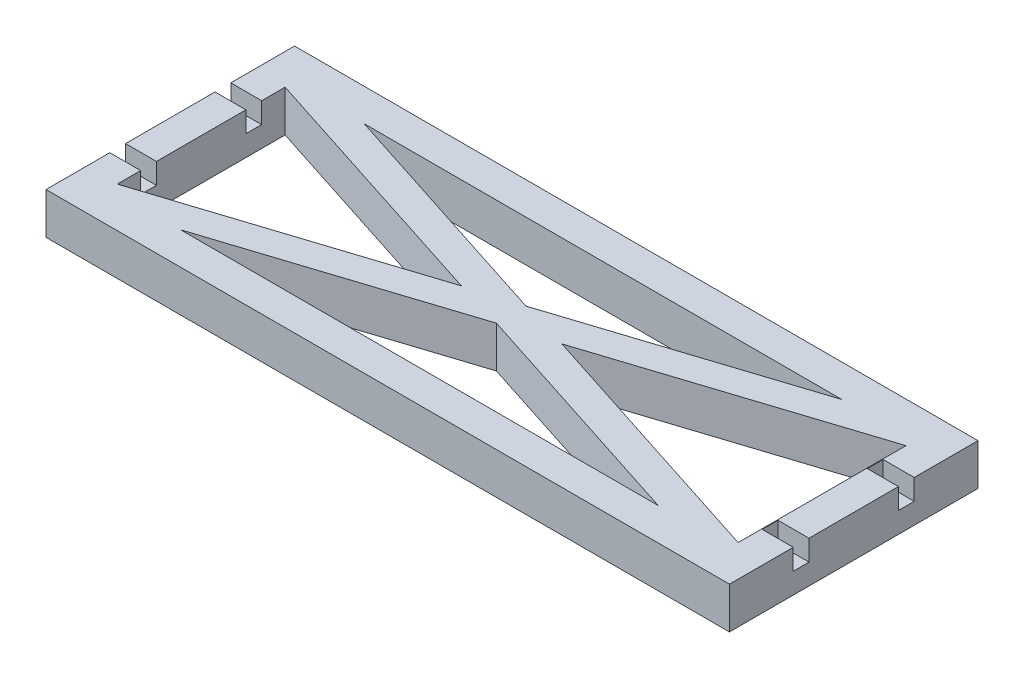
ISO-10303-21;
HEADER;
FILE_DESCRIPTION(('STEP AP214'),'2;1');
FILE_NAME('part.step','',(''),(''),'','','');
FILE_SCHEMA(('AUTOMOTIVE_DESIGN { 1 0 10303 214 1 1 1 1 }'));
ENDSEC;
DATA;
#1=APPLICATION_CONTEXT('core data for automotive mechanical design processes');
#2=APPLICATION_PROTOCOL_DEFINITION('international standard','automotive_design',2000,#1);
#3=PRODUCT_CONTEXT('',#1,'mechanical');
#4=PRODUCT('Part','Part','',(#3));
#5=PRODUCT_RELATED_PRODUCT_CATEGORY('part','',(#4));
#6=PRODUCT_DEFINITION_FORMATION('','',#4);
#7=PRODUCT_DEFINITION_CONTEXT('part definition',#1,'design');
#8=PRODUCT_DEFINITION('design','',#6,#7);
#9=PRODUCT_DEFINITION_SHAPE('','',#8);
#10=(LENGTH_UNIT() NAMED_UNIT(*) SI_UNIT(.MILLI.,.METRE.));
#11=(NAMED_UNIT(*) PLANE_ANGLE_UNIT() SI_UNIT($,.RADIAN.));
#12=(NAMED_UNIT(*) SI_UNIT($,.STERADIAN.) SOLID_ANGLE_UNIT());
#13=UNCERTAINTY_MEASURE_WITH_UNIT(LENGTH_MEASURE(1.E-05),#10,'distance_accuracy_value','');
#14=(GEOMETRIC_REPRESENTATION_CONTEXT(3) GLOBAL_UNCERTAINTY_ASSIGNED_CONTEXT((#13)) GLOBAL_UNIT_ASSIGNED_CONTEXT((#10,
#11,#12)) REPRESENTATION_CONTEXT('',''));
#15=CARTESIAN_POINT('',(0.,0.,0.));
#16=DIRECTION('',(0.,0.,1.));
#17=DIRECTION('',(1.,0.,0.));
#18=AXIS2_PLACEMENT_3D('',#15,#16,#17);
#19=CARTESIAN_POINT('',(82.5,10.,0.));
#20=DIRECTION('',(-1.,0.,0.));
#21=DIRECTION('',(0.,0.,1.));
#22=AXIS2_PLACEMENT_3D('',#19,#20,#21);
#23=PLANE('',#22);
#24=DIRECTION('',(0.,1.,0.));
#25=VECTOR('',#24,1.);
#26=CARTESIAN_POINT('',(82.5,5.,-10.795));
#27=LINE('',#26,#25);
#28=CARTESIAN_POINT('',(82.5,5.,-10.795));
#29=VERTEX_POINT('',#28);
#30=CARTESIAN_POINT('',(82.5,10.,-10.795));
#31=VERTEX_POINT('',#30);
#32=EDGE_CURVE('E262',#29,#31,#27,.T.);
#33=ORIENTED_EDGE('',*,*,#32,.T.);
#34=DIRECTION('',(0.,0.,-1.));
#35=VECTOR('',#34,1.);
#36=CARTESIAN_POINT('',(82.5,10.,0.));
#37=LINE('',#36,#35);
#38=CARTESIAN_POINT('',(82.5,10.,10.795));
#39=VERTEX_POINT('',#38);
#40=EDGE_CURVE('E378',#39,#31,#37,.T.);
#41=ORIENTED_EDGE('',*,*,#40,.F.);
#42=DIRECTION('',(0.,-1.,0.));
#43=VECTOR('',#42,1.);
#44=CARTESIAN_POINT('',(82.5,10.,10.795));
#45=LINE('',#44,#43);
#46=CARTESIAN_POINT('',(82.5,5.,10.795));
#47=VERTEX_POINT('',#46);
#48=EDGE_CURVE('E290',#39,#47,#45,.T.);
#49=ORIENTED_EDGE('',*,*,#48,.T.);
#50=DIRECTION('',(0.,0.,1.));
#51=VECTOR('',#50,1.);
#52=CARTESIAN_POINT('',(82.5,5.,14.605));
#53=LINE('',#52,#51);
#54=CARTESIAN_POINT('',(82.5,5.,14.605));
#55=VERTEX_POINT('',#54);
#56=EDGE_CURVE('E300',#47,#55,#53,.T.);
#57=ORIENTED_EDGE('',*,*,#56,.T.);
#58=DIRECTION('',(0.,1.,0.));
#59=VECTOR('',#58,1.);
#60=CARTESIAN_POINT('',(82.5,10.,14.605));
#61=LINE('',#60,#59);
#62=CARTESIAN_POINT('',(82.5,10.,14.605));
#63=VERTEX_POINT('',#62);
#64=EDGE_CURVE('E297',#55,#63,#61,.T.);
#65=ORIENTED_EDGE('',*,*,#64,.T.);
#66=CARTESIAN_POINT('',(82.5,10.,30.));
#67=VERTEX_POINT('',#66);
#68=EDGE_CURVE('E374',#67,#63,#37,.T.);
#69=ORIENTED_EDGE('',*,*,#68,.F.);
#70=DIRECTION('',(0.,-1.,0.));
#71=VECTOR('',#70,1.);
#72=CARTESIAN_POINT('',(82.5,10.,30.));
#73=LINE('',#72,#71);
#74=CARTESIAN_POINT('',(82.5,0.,30.));
#75=VERTEX_POINT('',#74);
#76=EDGE_CURVE('E448',#67,#75,#73,.T.);
#77=ORIENTED_EDGE('',*,*,#76,.T.);
#78=DIRECTION('',(0.,0.,-1.));
#79=VECTOR('',#78,1.);
#80=CARTESIAN_POINT('',(82.5,0.,0.));
#81=LINE('',#80,#79);
#82=CARTESIAN_POINT('',(82.5,0.,-30.));
#83=VERTEX_POINT('',#82);
#84=EDGE_CURVE('E423',#75,#83,#81,.T.);
#85=ORIENTED_EDGE('',*,*,#84,.T.);
#86=DIRECTION('',(0.,-1.,0.));
#87=VECTOR('',#86,1.);
#88=CARTESIAN_POINT('',(82.5,10.,-30.));
#89=LINE('',#88,#87);
#90=CARTESIAN_POINT('',(82.5,10.,-30.));
#91=VERTEX_POINT('',#90);
#92=EDGE_CURVE('E443',#91,#83,#89,.T.);
#93=ORIENTED_EDGE('',*,*,#92,.F.);
#94=CARTESIAN_POINT('',(82.5,10.,-14.605));
#95=VERTEX_POINT('',#94);
#96=EDGE_CURVE('E373',#95,#91,#37,.T.);
#97=ORIENTED_EDGE('',*,*,#96,.F.);
#98=DIRECTION('',(0.,-1.,0.));
#99=VECTOR('',#98,1.);
#100=CARTESIAN_POINT('',(82.5,10.,-14.605));
#101=LINE('',#100,#99);
#102=CARTESIAN_POINT('',(82.5,5.,-14.605));
#103=VERTEX_POINT('',#102);
#104=EDGE_CURVE('E268',#95,#103,#101,.T.);
#105=ORIENTED_EDGE('',*,*,#104,.T.);
#106=DIRECTION('',(0.,0.,1.));
#107=VECTOR('',#106,1.);
#108=CARTESIAN_POINT('',(82.5,5.,-10.795));
#109=LINE('',#108,#107);
#110=EDGE_CURVE('E271',#103,#29,#109,.T.);
#111=ORIENTED_EDGE('',*,*,#110,.T.);
#112=EDGE_LOOP('',(#33,#41,#49,#57,#65,#69,#77,#85,#93,#97,#105,#111));
#113=FACE_BOUND('',#112,.T.);
#114=ADVANCED_FACE('F40',(#113),#23,.F.);
#115=CARTESIAN_POINT('',(0.,10.,0.));
#116=DIRECTION('',(0.,1.,0.));
#117=DIRECTION('',(0.,0.,1.));
#118=AXIS2_PLACEMENT_3D('',#115,#116,#117);
#119=PLANE('',#118);
#120=DIRECTION('',(1.,0.,0.));
#121=VECTOR('',#120,1.);
#122=CARTESIAN_POINT('',(0.,10.,22.1658349914552));
#123=LINE('',#122,#121);
#124=CARTESIAN_POINT('',(-57.8346231707164,10.,22.1658349914552));
#125=VERTEX_POINT('',#124);
#126=CARTESIAN_POINT('',(57.4604582637845,10.,22.1658349914552));
#127=VERTEX_POINT('',#126);
#128=EDGE_CURVE('E348',#125,#127,#123,.T.);
#129=ORIENTED_EDGE('',*,*,#128,.F.);
#130=DIRECTION('',(0.951708617760551,0.,-0.307002779922759));
#131=VECTOR('',#130,1.);
#132=CARTESIAN_POINT('',(1.02539729526811,10.,3.17873161533114));
#133=LINE('',#132,#131);
#134=CARTESIAN_POINT('',(-0.187082453465993,10.,3.56985411492279));
#135=VERTEX_POINT('',#134);
#136=EDGE_CURVE('E351',#125,#135,#133,.T.);
#137=ORIENTED_EDGE('',*,*,#136,.T.);
#138=DIRECTION('',(0.951708617760551,0.,0.307002779922758));
#139=VECTOR('',#138,1.);
#140=CARTESIAN_POINT('',(-1.06066260223625,10.,3.28805406693238));
#141=LINE('',#140,#139);
#142=EDGE_CURVE('E354',#135,#127,#141,.T.);
#143=ORIENTED_EDGE('',*,*,#142,.T.);
#144=EDGE_LOOP('',(#129,#137,#143));
#145=FACE_BOUND('',#144,.T.);
#146=DIRECTION('',(-0.951708617760551,0.,0.307002779922759));
#147=VECTOR('',#146,1.);
#148=CARTESIAN_POINT('',(1.13471977655831,10.,3.51763130733076));
#149=LINE('',#148,#147);
#150=CARTESIAN_POINT('',(74.8529175465339,10.,-20.2624324894356));
#151=VERTEX_POINT('',#150);
#152=CARTESIAN_POINT('',(12.0393768292836,10.,0.));
#153=VERTEX_POINT('',#152);
#154=EDGE_CURVE('E356',#151,#153,#149,.T.);
#155=ORIENTED_EDGE('',*,*,#154,.F.);
#156=DIRECTION('',(0.,0.,1.));
#157=VECTOR('',#156,1.);
#158=CARTESIAN_POINT('',(74.8529175465339,10.,0.));
#159=LINE('',#158,#157);
#160=CARTESIAN_POINT('',(74.8529175465339,10.,20.2624324894356));
#161=VERTEX_POINT('',#160);
#162=EDGE_CURVE('E359',#151,#161,#159,.T.);
#163=ORIENTED_EDGE('',*,*,#162,.T.);
#164=DIRECTION('',(-0.951708617760551,0.,-0.307002779922759));
#165=VECTOR('',#164,1.);
#166=CARTESIAN_POINT('',(1.13471977655831,10.,-3.51763130733077));
#167=LINE('',#166,#165);
#168=EDGE_CURVE('E362',#161,#153,#167,.T.);
#169=ORIENTED_EDGE('',*,*,#168,.T.);
#170=EDGE_LOOP('',(#155,#163,#169));
#171=FACE_BOUND('',#170,.T.);
#172=DIRECTION('',(0.951708617760551,0.,-0.307002779922758));
#173=VECTOR('',#172,1.);
#174=CARTESIAN_POINT('',(-1.06066260223625,10.,-3.28805406693238));
#175=LINE('',#174,#173);
#176=CARTESIAN_POINT('',(-0.187082453465989,10.,-3.56985411492279));
#177=VERTEX_POINT('',#176);
#178=CARTESIAN_POINT('',(57.4604582637846,10.,-22.1658349914552));
#179=VERTEX_POINT('',#178);
#180=EDGE_CURVE('E364',#177,#179,#175,.T.);
#181=ORIENTED_EDGE('',*,*,#180,.F.);
#182=DIRECTION('',(0.951708617760551,0.,0.307002779922759));
#183=VECTOR('',#182,1.);
#184=CARTESIAN_POINT('',(1.02539729526811,10.,-3.17873161533114));
#185=LINE('',#184,#183);
#186=CARTESIAN_POINT('',(-57.8346231707164,10.,-22.1658349914552));
#187=VERTEX_POINT('',#186);
#188=EDGE_CURVE('E367',#187,#177,#185,.T.);
#189=ORIENTED_EDGE('',*,*,#188,.F.);
#190=DIRECTION('',(-1.,0.,0.));
#191=VECTOR('',#190,1.);
#192=CARTESIAN_POINT('',(0.,10.,-22.1658349914552));
#193=LINE('',#192,#191);
#194=EDGE_CURVE('E370',#179,#187,#193,.T.);
#195=ORIENTED_EDGE('',*,*,#194,.F.);
#196=EDGE_LOOP('',(#181,#189,#195));
#197=FACE_BOUND('',#196,.T.);
#198=ORIENTED_EDGE('',*,*,#40,.T.);
#199=DIRECTION('',(1.,0.,0.));
#200=VECTOR('',#199,1.);
#201=CARTESIAN_POINT('',(75.,10.,-10.795));
#202=LINE('',#201,#200);
#203=CARTESIAN_POINT('',(75.,10.,-10.795));
#204=VERTEX_POINT('',#203);
#205=EDGE_CURVE('E279',#204,#31,#202,.T.);
#206=ORIENTED_EDGE('',*,*,#205,.F.);
#207=DIRECTION('',(0.,0.,-1.));
#208=VECTOR('',#207,1.);
#209=CARTESIAN_POINT('',(75.,10.,-14.605));
#210=LINE('',#209,#208);
#211=CARTESIAN_POINT('',(75.,10.,-14.605));
#212=VERTEX_POINT('',#211);
#213=EDGE_CURVE('E264',#204,#212,#210,.T.);
#214=ORIENTED_EDGE('',*,*,#213,.T.);
#215=DIRECTION('',(1.,0.,0.));
#216=VECTOR('',#215,1.);
#217=CARTESIAN_POINT('',(75.,10.,-14.605));
#218=LINE('',#217,#216);
#219=EDGE_CURVE('E282',#212,#95,#218,.T.);
#220=ORIENTED_EDGE('',*,*,#219,.T.);
#221=ORIENTED_EDGE('',*,*,#96,.T.);
#222=DIRECTION('',(-1.,0.,0.));
#223=VECTOR('',#222,1.);
#224=CARTESIAN_POINT('',(0.,10.,-30.));
#225=LINE('',#224,#223);
#226=CARTESIAN_POINT('',(-82.5,10.,-30.));
#227=VERTEX_POINT('',#226);
#228=EDGE_CURVE('E377',#91,#227,#225,.T.);
#229=ORIENTED_EDGE('',*,*,#228,.T.);
#230=DIRECTION('',(0.,0.,1.));
#231=VECTOR('',#230,1.);
#232=CARTESIAN_POINT('',(-82.5,10.,0.));
#233=LINE('',#232,#231);
#234=CARTESIAN_POINT('',(-82.5,10.,-14.605));
#235=VERTEX_POINT('',#234);
#236=EDGE_CURVE('E381',#227,#235,#233,.T.);
#237=ORIENTED_EDGE('',*,*,#236,.T.);
#238=DIRECTION('',(-1.,0.,0.));
#239=VECTOR('',#238,1.);
#240=CARTESIAN_POINT('',(0.,10.,-14.605));
#241=LINE('',#240,#239);
#242=CARTESIAN_POINT('',(-75.04,10.,-14.605));
#243=VERTEX_POINT('',#242);
#244=EDGE_CURVE('E48',#243,#235,#241,.T.);
#245=ORIENTED_EDGE('',*,*,#244,.F.);
#246=DIRECTION('',(0.,0.,1.));
#247=VECTOR('',#246,1.);
#248=CARTESIAN_POINT('',(-75.04,10.,0.));
#249=LINE('',#248,#247);
#250=CARTESIAN_POINT('',(-75.04,10.,-20.2624324894356));
#251=VERTEX_POINT('',#250);
#252=EDGE_CURVE('E388',#251,#243,#249,.T.);
#253=ORIENTED_EDGE('',*,*,#252,.F.);
#254=DIRECTION('',(0.951708617760551,0.,0.307002779922758));
#255=VECTOR('',#254,1.);
#256=CARTESIAN_POINT('',(-1.15235243004238,10.,3.57229253313137));
#257=LINE('',#256,#255);
#258=CARTESIAN_POINT('',(-12.2264592827496,10.,0.));
#259=VERTEX_POINT('',#258);
#260=EDGE_CURVE('E391',#251,#259,#257,.T.);
#261=ORIENTED_EDGE('',*,*,#260,.T.);
#262=DIRECTION('',(0.951708617760551,0.,-0.307002779922759));
#263=VECTOR('',#262,1.);
#264=CARTESIAN_POINT('',(-1.15235243004238,10.,-3.57229253313138));
#265=LINE('',#264,#263);
#266=CARTESIAN_POINT('',(-75.04,10.,20.2624324894356));
#267=VERTEX_POINT('',#266);
#268=EDGE_CURVE('E394',#267,#259,#265,.T.);
#269=ORIENTED_EDGE('',*,*,#268,.F.);
#270=CARTESIAN_POINT('',(-75.04,10.,14.605));
#271=VERTEX_POINT('',#270);
#272=EDGE_CURVE('E387',#271,#267,#249,.T.);
#273=ORIENTED_EDGE('',*,*,#272,.F.);
#274=DIRECTION('',(1.,0.,0.));
#275=VECTOR('',#274,1.);
#276=CARTESIAN_POINT('',(0.,10.,14.605));
#277=LINE('',#276,#275);
#278=CARTESIAN_POINT('',(-82.5,10.,14.605));
#279=VERTEX_POINT('',#278);
#280=EDGE_CURVE('E479',#279,#271,#277,.T.);
#281=ORIENTED_EDGE('',*,*,#280,.F.);
#282=CARTESIAN_POINT('',(-82.5,10.,30.));
#283=VERTEX_POINT('',#282);
#284=EDGE_CURVE('E380',#279,#283,#233,.T.);
#285=ORIENTED_EDGE('',*,*,#284,.T.);
#286=DIRECTION('',(1.,0.,0.));
#287=VECTOR('',#286,1.);
#288=CARTESIAN_POINT('',(0.,10.,30.));
#289=LINE('',#288,#287);
#290=EDGE_CURVE('E384',#283,#67,#289,.T.);
#291=ORIENTED_EDGE('',*,*,#290,.T.);
#292=ORIENTED_EDGE('',*,*,#68,.T.);
#293=DIRECTION('',(1.,0.,0.));
#294=VECTOR('',#293,1.);
#295=CARTESIAN_POINT('',(75.,10.,14.605));
#296=LINE('',#295,#294);
#297=CARTESIAN_POINT('',(75.,10.,14.605));
#298=VERTEX_POINT('',#297);
#299=EDGE_CURVE('E277',#298,#63,#296,.T.);
#300=ORIENTED_EDGE('',*,*,#299,.F.);
#301=DIRECTION('',(0.,0.,-1.));
#302=VECTOR('',#301,1.);
#303=CARTESIAN_POINT('',(75.,10.,14.605));
#304=LINE('',#303,#302);
#305=CARTESIAN_POINT('',(75.,10.,10.795));
#306=VERTEX_POINT('',#305);
#307=EDGE_CURVE('E293',#298,#306,#304,.T.);
#308=ORIENTED_EDGE('',*,*,#307,.T.);
#309=DIRECTION('',(1.,0.,0.));
#310=VECTOR('',#309,1.);
#311=CARTESIAN_POINT('',(75.,10.,10.795));
#312=LINE('',#311,#310);
#313=EDGE_CURVE('E306',#306,#39,#312,.T.);
#314=ORIENTED_EDGE('',*,*,#313,.T.);
#315=EDGE_LOOP('',(#198,#206,#214,#220,#221,#229,#237,#245,#253,#261,#269,#273,#281,#285,#291,
#292,#300,#308,#314));
#316=FACE_BOUND('',#315,.T.);
#317=ADVANCED_FACE('F495',(#145,#171,#197,#316),#119,.T.);
#318=DIRECTION('',(1.,0.,0.));
#319=VECTOR('',#318,1.);
#320=CARTESIAN_POINT('',(0.,10.,-10.795));
#321=LINE('',#320,#319);
#322=CARTESIAN_POINT('',(-82.5,10.,-10.795));
#323=VERTEX_POINT('',#322);
#324=CARTESIAN_POINT('',(-75.04,10.,-10.795));
#325=VERTEX_POINT('',#324);
#326=EDGE_CURVE('E11',#323,#325,#321,.T.);
#327=ORIENTED_EDGE('',*,*,#326,.F.);
#328=CARTESIAN_POINT('',(-82.5,10.,10.795));
#329=VERTEX_POINT('',#328);
#330=EDGE_CURVE('E385',#323,#329,#233,.T.);
#331=ORIENTED_EDGE('',*,*,#330,.T.);
#332=DIRECTION('',(-1.,0.,0.));
#333=VECTOR('',#332,1.);
#334=CARTESIAN_POINT('',(0.,10.,10.795));
#335=LINE('',#334,#333);
#336=CARTESIAN_POINT('',(-75.04,10.,10.795));
#337=VERTEX_POINT('',#336);
#338=EDGE_CURVE('E447',#337,#329,#335,.T.);
#339=ORIENTED_EDGE('',*,*,#338,.F.);
#340=EDGE_CURVE('E392',#325,#337,#249,.T.);
#341=ORIENTED_EDGE('',*,*,#340,.F.);
#342=EDGE_LOOP('',(#327,#331,#339,#341));
#343=FACE_BOUND('',#342,.T.);
#344=ADVANCED_FACE('F525',(#343),#119,.T.);
#345=CARTESIAN_POINT('',(-75.04,10.,0.));
#346=DIRECTION('',(1.,0.,0.));
#347=DIRECTION('',(0.,0.,-1.));
#348=AXIS2_PLACEMENT_3D('',#345,#346,#347);
#349=PLANE('',#348);
#350=DIRECTION('',(0.,-1.,0.));
#351=VECTOR('',#350,1.);
#352=CARTESIAN_POINT('',(-75.04,10.,-10.795));
#353=LINE('',#352,#351);
#354=CARTESIAN_POINT('',(-75.04,5.,-10.795));
#355=VERTEX_POINT('',#354);
#356=EDGE_CURVE('E341',#325,#355,#353,.T.);
#357=ORIENTED_EDGE('',*,*,#356,.F.);
#358=ORIENTED_EDGE('',*,*,#340,.T.);
#359=DIRECTION('',(0.,1.,0.));
#360=VECTOR('',#359,1.);
#361=CARTESIAN_POINT('',(-75.04,10.,10.795));
#362=LINE('',#361,#360);
#363=CARTESIAN_POINT('',(-75.04,5.,10.795));
#364=VERTEX_POINT('',#363);
#365=EDGE_CURVE('E324',#364,#337,#362,.T.);
#366=ORIENTED_EDGE('',*,*,#365,.F.);
#367=DIRECTION('',(0.,0.,-1.));
#368=VECTOR('',#367,1.);
#369=CARTESIAN_POINT('',(-75.04,5.,0.));
#370=LINE('',#369,#368);
#371=CARTESIAN_POINT('',(-75.04,5.,14.605));
#372=VERTEX_POINT('',#371);
#373=EDGE_CURVE('E343',#372,#364,#370,.T.);
#374=ORIENTED_EDGE('',*,*,#373,.F.);
#375=DIRECTION('',(0.,-1.,0.));
#376=VECTOR('',#375,1.);
#377=CARTESIAN_POINT('',(-75.04,10.,14.605));
#378=LINE('',#377,#376);
#379=EDGE_CURVE('E337',#271,#372,#378,.T.);
#380=ORIENTED_EDGE('',*,*,#379,.F.);
#381=ORIENTED_EDGE('',*,*,#272,.T.);
#382=DIRECTION('',(0.,-1.,0.));
#383=VECTOR('',#382,1.);
#384=CARTESIAN_POINT('',(-75.04,10.,20.2624324894356));
#385=LINE('',#384,#383);
#386=CARTESIAN_POINT('',(-75.04,0.,20.2624324894356));
#387=VERTEX_POINT('',#386);
#388=EDGE_CURVE('E440',#267,#387,#385,.T.);
#389=ORIENTED_EDGE('',*,*,#388,.T.);
#390=DIRECTION('',(0.,0.,1.));
#391=VECTOR('',#390,1.);
#392=CARTESIAN_POINT('',(-75.04,0.,0.));
#393=LINE('',#392,#391);
#394=CARTESIAN_POINT('',(-75.04,0.,-20.2624324894356));
#395=VERTEX_POINT('',#394);
#396=EDGE_CURVE('E432',#395,#387,#393,.T.);
#397=ORIENTED_EDGE('',*,*,#396,.F.);
#398=DIRECTION('',(0.,-1.,0.));
#399=VECTOR('',#398,1.);
#400=CARTESIAN_POINT('',(-75.04,10.,-20.2624324894356));
#401=LINE('',#400,#399);
#402=EDGE_CURVE('E445',#251,#395,#401,.T.);
#403=ORIENTED_EDGE('',*,*,#402,.F.);
#404=ORIENTED_EDGE('',*,*,#252,.T.);
#405=DIRECTION('',(0.,1.,0.));
#406=VECTOR('',#405,1.);
#407=CARTESIAN_POINT('',(-75.04,10.,-14.605));
#408=LINE('',#407,#406);
#409=CARTESIAN_POINT('',(-75.04,5.,-14.605));
#410=VERTEX_POINT('',#409);
#411=EDGE_CURVE('E339',#410,#243,#408,.T.);
#412=ORIENTED_EDGE('',*,*,#411,.F.);
#413=DIRECTION('',(0.,0.,-1.));
#414=VECTOR('',#413,1.);
#415=CARTESIAN_POINT('',(-75.04,5.,0.));
#416=LINE('',#415,#414);
#417=EDGE_CURVE('E345',#355,#410,#416,.T.);
#418=ORIENTED_EDGE('',*,*,#417,.F.);
#419=EDGE_LOOP('',(#357,#358,#366,#374,#380,#381,#389,#397,#403,#404,#412,#418));
#420=FACE_BOUND('',#419,.T.);
#421=ADVANCED_FACE('F537',(#420),#349,.T.);
#422=CARTESIAN_POINT('',(-1.15235243004238,10.,3.57229253313137));
#423=DIRECTION('',(0.307002779922758,0.,-0.951708617760551));
#424=DIRECTION('',(-0.951708617760551,0.,-0.307002779922758));
#425=AXIS2_PLACEMENT_3D('',#422,#423,#424);
#426=PLANE('',#425);
#427=DIRECTION('',(0.951708617760551,0.,0.307002779922758));
#428=VECTOR('',#427,1.);
#429=CARTESIAN_POINT('',(-1.15235243004238,0.,3.57229253313137));
#430=LINE('',#429,#428);
#431=CARTESIAN_POINT('',(-12.2264592827496,0.,0.));
#432=VERTEX_POINT('',#431);
#433=EDGE_CURVE('E435',#395,#432,#430,.T.);
#434=ORIENTED_EDGE('',*,*,#433,.T.);
#435=DIRECTION('',(0.,-1.,0.));
#436=VECTOR('',#435,1.);
#437=CARTESIAN_POINT('',(-12.2264592827496,10.,0.));
#438=LINE('',#437,#436);
#439=EDGE_CURVE('E442',#259,#432,#438,.T.);
#440=ORIENTED_EDGE('',*,*,#439,.F.);
#441=ORIENTED_EDGE('',*,*,#260,.F.);
#442=ORIENTED_EDGE('',*,*,#402,.T.);
#443=EDGE_LOOP('',(#434,#440,#441,#442));
#444=FACE_BOUND('',#443,.T.);
#445=ADVANCED_FACE('F549',(#444),#426,.F.);
#446=CARTESIAN_POINT('',(0.,10.,-30.));
#447=DIRECTION('',(0.,0.,1.));
#448=DIRECTION('',(1.,0.,0.));
#449=AXIS2_PLACEMENT_3D('',#446,#447,#448);
#450=PLANE('',#449);
#451=DIRECTION('',(-1.,0.,0.));
#452=VECTOR('',#451,1.);
#453=CARTESIAN_POINT('',(0.,0.,-30.));
#454=LINE('',#453,#452);
#455=CARTESIAN_POINT('',(-82.5,0.,-30.));
#456=VERTEX_POINT('',#455);
#457=EDGE_CURVE('E426',#83,#456,#454,.T.);
#458=ORIENTED_EDGE('',*,*,#457,.T.);
#459=DIRECTION('',(0.,-1.,0.));
#460=VECTOR('',#459,1.);
#461=CARTESIAN_POINT('',(-82.5,10.,-30.));
#462=LINE('',#461,#460);
#463=EDGE_CURVE('E455',#227,#456,#462,.T.);
#464=ORIENTED_EDGE('',*,*,#463,.F.);
#465=ORIENTED_EDGE('',*,*,#228,.F.);
#466=ORIENTED_EDGE('',*,*,#92,.T.);
#467=EDGE_LOOP('',(#458,#464,#465,#466));
#468=FACE_BOUND('',#467,.T.);
#469=ADVANCED_FACE('F501',(#468),#450,.F.);
#470=CARTESIAN_POINT('',(-82.5,10.,0.));
#471=DIRECTION('',(1.,0.,0.));
#472=DIRECTION('',(0.,0.,-1.));
#473=AXIS2_PLACEMENT_3D('',#470,#471,#472);
#474=PLANE('',#473);
#475=ORIENTED_EDGE('',*,*,#330,.F.);
#476=DIRECTION('',(0.,1.,0.));
#477=VECTOR('',#476,1.);
#478=CARTESIAN_POINT('',(-82.5,5.,-10.795));
#479=LINE('',#478,#477);
#480=CARTESIAN_POINT('',(-82.5,5.,-10.795));
#481=VERTEX_POINT('',#480);
#482=EDGE_CURVE('E312',#481,#323,#479,.T.);
#483=ORIENTED_EDGE('',*,*,#482,.F.);
#484=DIRECTION('',(0.,0.,1.));
#485=VECTOR('',#484,1.);
#486=CARTESIAN_POINT('',(-82.5,5.,-10.795));
#487=LINE('',#486,#485);
#488=CARTESIAN_POINT('',(-82.5,5.,-14.605));
#489=VERTEX_POINT('',#488);
#490=EDGE_CURVE('E318',#489,#481,#487,.T.);
#491=ORIENTED_EDGE('',*,*,#490,.F.);
#492=DIRECTION('',(0.,-1.,0.));
#493=VECTOR('',#492,1.);
#494=CARTESIAN_POINT('',(-82.5,10.,-14.605));
#495=LINE('',#494,#493);
#496=EDGE_CURVE('E314',#235,#489,#495,.T.);
#497=ORIENTED_EDGE('',*,*,#496,.F.);
#498=ORIENTED_EDGE('',*,*,#236,.F.);
#499=ORIENTED_EDGE('',*,*,#463,.T.);
#500=DIRECTION('',(0.,0.,1.));
#501=VECTOR('',#500,1.);
#502=CARTESIAN_POINT('',(-82.5,0.,0.));
#503=LINE('',#502,#501);
#504=CARTESIAN_POINT('',(-82.5,0.,30.));
#505=VERTEX_POINT('',#504);
#506=EDGE_CURVE('E428',#456,#505,#503,.T.);
#507=ORIENTED_EDGE('',*,*,#506,.T.);
#508=DIRECTION('',(0.,-1.,0.));
#509=VECTOR('',#508,1.);
#510=CARTESIAN_POINT('',(-82.5,10.,30.));
#511=LINE('',#510,#509);
#512=EDGE_CURVE('E451',#283,#505,#511,.T.);
#513=ORIENTED_EDGE('',*,*,#512,.F.);
#514=ORIENTED_EDGE('',*,*,#284,.F.);
#515=DIRECTION('',(0.,1.,0.));
#516=VECTOR('',#515,1.);
#517=CARTESIAN_POINT('',(-82.5,10.,14.605));
#518=LINE('',#517,#516);
#519=CARTESIAN_POINT('',(-82.5,5.,14.605));
#520=VERTEX_POINT('',#519);
#521=EDGE_CURVE('E315',#520,#279,#518,.T.);
#522=ORIENTED_EDGE('',*,*,#521,.F.);
#523=DIRECTION('',(0.,0.,1.));
#524=VECTOR('',#523,1.);
#525=CARTESIAN_POINT('',(-82.5,5.,14.605));
#526=LINE('',#525,#524);
#527=CARTESIAN_POINT('',(-82.5,5.,10.795));
#528=VERTEX_POINT('',#527);
#529=EDGE_CURVE('E328',#528,#520,#526,.T.);
#530=ORIENTED_EDGE('',*,*,#529,.F.);
#531=DIRECTION('',(0.,-1.,0.));
#532=VECTOR('',#531,1.);
#533=CARTESIAN_POINT('',(-82.5,10.,10.795));
#534=LINE('',#533,#532);
#535=EDGE_CURVE('E332',#329,#528,#534,.T.);
#536=ORIENTED_EDGE('',*,*,#535,.F.);
#537=EDGE_LOOP('',(#475,#483,#491,#497,#498,#499,#507,#513,#514,#522,#530,#536));
#538=FACE_BOUND('',#537,.T.);
#539=ADVANCED_FACE('F492',(#538),#474,.F.);
#540=CARTESIAN_POINT('',(-1.06066260223625,10.,-3.28805406693238));
#541=DIRECTION('',(-0.307002779922758,0.,-0.951708617760551));
#542=DIRECTION('',(-0.951708617760551,0.,0.307002779922758));
#543=AXIS2_PLACEMENT_3D('',#540,#541,#542);
#544=PLANE('',#543);
#545=DIRECTION('',(0.951708617760551,0.,-0.307002779922758));
#546=VECTOR('',#545,1.);
#547=CARTESIAN_POINT('',(-1.06066260223625,0.,-3.28805406693238));
#548=LINE('',#547,#546);
#549=CARTESIAN_POINT('',(-0.187082453465989,0.,-3.56985411492279));
#550=VERTEX_POINT('',#549);
#551=CARTESIAN_POINT('',(57.4604582637846,0.,-22.1658349914552));
#552=VERTEX_POINT('',#551);
#553=EDGE_CURVE('E414',#550,#552,#548,.T.);
#554=ORIENTED_EDGE('',*,*,#553,.F.);
#555=DIRECTION('',(0.,-1.,0.));
#556=VECTOR('',#555,1.);
#557=CARTESIAN_POINT('',(-0.187082453465989,10.,-3.56985411492279));
#558=LINE('',#557,#556);
#559=EDGE_CURVE('E452',#177,#550,#558,.T.);
#560=ORIENTED_EDGE('',*,*,#559,.F.);
#561=ORIENTED_EDGE('',*,*,#180,.T.);
#562=DIRECTION('',(0.,-1.,0.));
#563=VECTOR('',#562,1.);
#564=CARTESIAN_POINT('',(57.4604582637846,10.,-22.1658349914552));
#565=LINE('',#564,#563);
#566=EDGE_CURVE('E460',#179,#552,#565,.T.);
#567=ORIENTED_EDGE('',*,*,#566,.T.);
#568=EDGE_LOOP('',(#554,#560,#561,#567));
#569=FACE_BOUND('',#568,.T.);
#570=ADVANCED_FACE('F587',(#569),#544,.T.);
#571=CARTESIAN_POINT('',(1.02539729526811,10.,-3.17873161533114));
#572=DIRECTION('',(0.307002779922759,0.,-0.951708617760551));
#573=DIRECTION('',(-0.951708617760551,0.,-0.307002779922759));
#574=AXIS2_PLACEMENT_3D('',#571,#572,#573);
#575=PLANE('',#574);
#576=DIRECTION('',(0.951708617760551,0.,0.307002779922759));
#577=VECTOR('',#576,1.);
#578=CARTESIAN_POINT('',(1.02539729526811,0.,-3.17873161533114));
#579=LINE('',#578,#577);
#580=CARTESIAN_POINT('',(-57.8346231707164,0.,-22.1658349914552));
#581=VERTEX_POINT('',#580);
#582=EDGE_CURVE('E417',#581,#550,#579,.T.);
#583=ORIENTED_EDGE('',*,*,#582,.F.);
#584=DIRECTION('',(0.,-1.,0.));
#585=VECTOR('',#584,1.);
#586=CARTESIAN_POINT('',(-57.8346231707164,10.,-22.1658349914552));
#587=LINE('',#586,#585);
#588=EDGE_CURVE('E462',#187,#581,#587,.T.);
#589=ORIENTED_EDGE('',*,*,#588,.F.);
#590=ORIENTED_EDGE('',*,*,#188,.T.);
#591=ORIENTED_EDGE('',*,*,#559,.T.);
#592=EDGE_LOOP('',(#583,#589,#590,#591));
#593=FACE_BOUND('',#592,.T.);
#594=ADVANCED_FACE('F583',(#593),#575,.T.);
#595=CARTESIAN_POINT('',(1.13471977655831,10.,3.51763130733076));
#596=DIRECTION('',(0.307002779922759,0.,0.951708617760551));
#597=DIRECTION('',(0.951708617760551,0.,-0.307002779922759));
#598=AXIS2_PLACEMENT_3D('',#595,#596,#597);
#599=PLANE('',#598);
#600=DIRECTION('',(-0.951708617760551,0.,0.307002779922759));
#601=VECTOR('',#600,1.);
#602=CARTESIAN_POINT('',(1.13471977655831,0.,3.51763130733076));
#603=LINE('',#602,#601);
#604=CARTESIAN_POINT('',(74.8529175465339,0.,-20.2624324894356));
#605=VERTEX_POINT('',#604);
#606=CARTESIAN_POINT('',(12.0393768292836,0.,0.));
#607=VERTEX_POINT('',#606);
#608=EDGE_CURVE('E405',#605,#607,#603,.T.);
#609=ORIENTED_EDGE('',*,*,#608,.F.);
#610=DIRECTION('',(0.,-1.,0.));
#611=VECTOR('',#610,1.);
#612=CARTESIAN_POINT('',(74.8529175465339,10.,-20.2624324894356));
#613=LINE('',#612,#611);
#614=EDGE_CURVE('E463',#151,#605,#613,.T.);
#615=ORIENTED_EDGE('',*,*,#614,.F.);
#616=ORIENTED_EDGE('',*,*,#154,.T.);
#617=DIRECTION('',(0.,-1.,0.));
#618=VECTOR('',#617,1.);
#619=CARTESIAN_POINT('',(12.0393768292836,10.,0.));
#620=LINE('',#619,#618);
#621=EDGE_CURVE('E466',#153,#607,#620,.T.);
#622=ORIENTED_EDGE('',*,*,#621,.T.);
#623=EDGE_LOOP('',(#609,#615,#616,#622));
#624=FACE_BOUND('',#623,.T.);
#625=ADVANCED_FACE('F586',(#624),#599,.T.);
#626=CARTESIAN_POINT('',(74.8529175465339,10.,0.));
#627=DIRECTION('',(1.,0.,0.));
#628=DIRECTION('',(0.,0.,-1.));
#629=AXIS2_PLACEMENT_3D('',#626,#627,#628);
#630=PLANE('',#629);
#631=DIRECTION('',(0.,0.,1.));
#632=VECTOR('',#631,1.);
#633=CARTESIAN_POINT('',(74.8529175465339,0.,0.));
#634=LINE('',#633,#632);
#635=CARTESIAN_POINT('',(74.8529175465339,0.,20.2624324894356));
#636=VERTEX_POINT('',#635);
#637=EDGE_CURVE('E408',#605,#636,#634,.T.);
#638=ORIENTED_EDGE('',*,*,#637,.T.);
#639=DIRECTION('',(0.,-1.,0.));
#640=VECTOR('',#639,1.);
#641=CARTESIAN_POINT('',(74.8529175465339,10.,20.2624324894356));
#642=LINE('',#641,#640);
#643=EDGE_CURVE('E468',#161,#636,#642,.T.);
#644=ORIENTED_EDGE('',*,*,#643,.F.);
#645=ORIENTED_EDGE('',*,*,#162,.F.);
#646=ORIENTED_EDGE('',*,*,#614,.T.);
#647=EDGE_LOOP('',(#638,#644,#645,#646));
#648=FACE_BOUND('',#647,.T.);
#649=ADVANCED_FACE('F596',(#648),#630,.F.);
#650=CARTESIAN_POINT('',(0.,10.,22.1658349914552));
#651=DIRECTION('',(0.,0.,-1.));
#652=DIRECTION('',(-1.,0.,0.));
#653=AXIS2_PLACEMENT_3D('',#650,#651,#652);
#654=PLANE('',#653);
#655=DIRECTION('',(1.,0.,0.));
#656=VECTOR('',#655,1.);
#657=CARTESIAN_POINT('',(0.,0.,22.1658349914552));
#658=LINE('',#657,#656);
#659=CARTESIAN_POINT('',(-57.8346231707164,0.,22.1658349914552));
#660=VERTEX_POINT('',#659);
#661=CARTESIAN_POINT('',(57.4604582637845,0.,22.1658349914552));
#662=VERTEX_POINT('',#661);
#663=EDGE_CURVE('E347',#660,#662,#658,.T.);
#664=ORIENTED_EDGE('',*,*,#663,.F.);
#665=DIRECTION('',(0.,-1.,0.));
#666=VECTOR('',#665,1.);
#667=CARTESIAN_POINT('',(-57.8346231707164,10.,22.1658349914552));
#668=LINE('',#667,#666);
#669=EDGE_CURVE('E469',#125,#660,#668,.T.);
#670=ORIENTED_EDGE('',*,*,#669,.F.);
#671=ORIENTED_EDGE('',*,*,#128,.T.);
#672=DIRECTION('',(0.,-1.,0.));
#673=VECTOR('',#672,1.);
#674=CARTESIAN_POINT('',(57.4604582637845,10.,22.1658349914552));
#675=LINE('',#674,#673);
#676=EDGE_CURVE('E397',#127,#662,#675,.T.);
#677=ORIENTED_EDGE('',*,*,#676,.T.);
#678=EDGE_LOOP('',(#664,#670,#671,#677));
#679=FACE_BOUND('',#678,.T.);
#680=ADVANCED_FACE('F42',(#679),#654,.T.);
#681=CARTESIAN_POINT('',(1.02539729526811,10.,3.17873161533114));
#682=DIRECTION('',(-0.307002779922759,0.,-0.951708617760551));
#683=DIRECTION('',(-0.951708617760551,0.,0.307002779922759));
#684=AXIS2_PLACEMENT_3D('',#681,#682,#683);
#685=PLANE('',#684);
#686=DIRECTION('',(0.951708617760551,0.,-0.307002779922759));
#687=VECTOR('',#686,1.);
#688=CARTESIAN_POINT('',(1.02539729526811,0.,3.17873161533114));
#689=LINE('',#688,#687);
#690=CARTESIAN_POINT('',(-0.187082453465993,0.,3.56985411492279));
#691=VERTEX_POINT('',#690);
#692=EDGE_CURVE('E400',#660,#691,#689,.T.);
#693=ORIENTED_EDGE('',*,*,#692,.T.);
#694=DIRECTION('',(0.,-1.,0.));
#695=VECTOR('',#694,1.);
#696=CARTESIAN_POINT('',(-0.187082453465993,10.,3.56985411492279));
#697=LINE('',#696,#695);
#698=EDGE_CURVE('E474',#135,#691,#697,.T.);
#699=ORIENTED_EDGE('',*,*,#698,.F.);
#700=ORIENTED_EDGE('',*,*,#136,.F.);
#701=ORIENTED_EDGE('',*,*,#669,.T.);
#702=EDGE_LOOP('',(#693,#699,#700,#701));
#703=FACE_BOUND('',#702,.T.);
#704=ADVANCED_FACE('F605',(#703),#685,.F.);
#705=CARTESIAN_POINT('',(0.,10.,30.));
#706=DIRECTION('',(0.,0.,-1.));
#707=DIRECTION('',(-1.,0.,0.));
#708=AXIS2_PLACEMENT_3D('',#705,#706,#707);
#709=PLANE('',#708);
#710=DIRECTION('',(1.,0.,0.));
#711=VECTOR('',#710,1.);
#712=CARTESIAN_POINT('',(0.,0.,30.));
#713=LINE('',#712,#711);
#714=EDGE_CURVE('E430',#505,#75,#713,.T.);
#715=ORIENTED_EDGE('',*,*,#714,.T.);
#716=ORIENTED_EDGE('',*,*,#76,.F.);
#717=ORIENTED_EDGE('',*,*,#290,.F.);
#718=ORIENTED_EDGE('',*,*,#512,.T.);
#719=EDGE_LOOP('',(#715,#716,#717,#718));
#720=FACE_BOUND('',#719,.T.);
#721=ADVANCED_FACE('F511',(#720),#709,.F.);
#722=CARTESIAN_POINT('',(0.,10.,-22.1658349914552));
#723=DIRECTION('',(0.,0.,1.));
#724=DIRECTION('',(1.,0.,0.));
#725=AXIS2_PLACEMENT_3D('',#722,#723,#724);
#726=PLANE('',#725);
#727=DIRECTION('',(-1.,0.,0.));
#728=VECTOR('',#727,1.);
#729=CARTESIAN_POINT('',(0.,0.,-22.1658349914552));
#730=LINE('',#729,#728);
#731=EDGE_CURVE('E420',#552,#581,#730,.T.);
#732=ORIENTED_EDGE('',*,*,#731,.F.);
#733=ORIENTED_EDGE('',*,*,#566,.F.);
#734=ORIENTED_EDGE('',*,*,#194,.T.);
#735=ORIENTED_EDGE('',*,*,#588,.T.);
#736=EDGE_LOOP('',(#732,#733,#734,#735));
#737=FACE_BOUND('',#736,.T.);
#738=ADVANCED_FACE('F578',(#737),#726,.T.);
#739=CARTESIAN_POINT('',(1.13471977655831,10.,-3.51763130733077));
#740=DIRECTION('',(-0.307002779922759,0.,0.951708617760551));
#741=DIRECTION('',(0.951708617760551,0.,0.307002779922759));
#742=AXIS2_PLACEMENT_3D('',#739,#740,#741);
#743=PLANE('',#742);
#744=DIRECTION('',(-0.951708617760551,0.,-0.307002779922759));
#745=VECTOR('',#744,1.);
#746=CARTESIAN_POINT('',(1.13471977655831,0.,-3.51763130733077));
#747=LINE('',#746,#745);
#748=EDGE_CURVE('E411',#636,#607,#747,.T.);
#749=ORIENTED_EDGE('',*,*,#748,.T.);
#750=ORIENTED_EDGE('',*,*,#621,.F.);
#751=ORIENTED_EDGE('',*,*,#168,.F.);
#752=ORIENTED_EDGE('',*,*,#643,.T.);
#753=EDGE_LOOP('',(#749,#750,#751,#752));
#754=FACE_BOUND('',#753,.T.);
#755=ADVANCED_FACE('F581',(#754),#743,.F.);
#756=CARTESIAN_POINT('',(-1.06066260223625,10.,3.28805406693238));
#757=DIRECTION('',(0.307002779922758,0.,-0.951708617760551));
#758=DIRECTION('',(-0.951708617760551,0.,-0.307002779922758));
#759=AXIS2_PLACEMENT_3D('',#756,#757,#758);
#760=PLANE('',#759);
#761=DIRECTION('',(0.951708617760551,0.,0.307002779922758));
#762=VECTOR('',#761,1.);
#763=CARTESIAN_POINT('',(-1.06066260223625,0.,3.28805406693238));
#764=LINE('',#763,#762);
#765=EDGE_CURVE('E402',#691,#662,#764,.T.);
#766=ORIENTED_EDGE('',*,*,#765,.T.);
#767=ORIENTED_EDGE('',*,*,#676,.F.);
#768=ORIENTED_EDGE('',*,*,#142,.F.);
#769=ORIENTED_EDGE('',*,*,#698,.T.);
#770=EDGE_LOOP('',(#766,#767,#768,#769));
#771=FACE_BOUND('',#770,.T.);
#772=ADVANCED_FACE('F594',(#771),#760,.F.);
#773=CARTESIAN_POINT('',(-1.15235243004238,10.,-3.57229253313138));
#774=DIRECTION('',(-0.307002779922758,0.,-0.951708617760551));
#775=DIRECTION('',(-0.951708617760551,0.,0.307002779922759));
#776=AXIS2_PLACEMENT_3D('',#773,#774,#775);
#777=PLANE('',#776);
#778=DIRECTION('',(0.951708617760551,0.,-0.307002779922759));
#779=VECTOR('',#778,1.);
#780=CARTESIAN_POINT('',(-1.15235243004238,0.,-3.57229253313138));
#781=LINE('',#780,#779);
#782=EDGE_CURVE('E352',#387,#432,#781,.T.);
#783=ORIENTED_EDGE('',*,*,#782,.F.);
#784=ORIENTED_EDGE('',*,*,#388,.F.);
#785=ORIENTED_EDGE('',*,*,#268,.T.);
#786=ORIENTED_EDGE('',*,*,#439,.T.);
#787=EDGE_LOOP('',(#783,#784,#785,#786));
#788=FACE_BOUND('',#787,.T.);
#789=ADVANCED_FACE('F545',(#788),#777,.T.);
#790=CARTESIAN_POINT('',(0.,0.,0.));
#791=DIRECTION('',(0.,1.,0.));
#792=DIRECTION('',(0.,0.,1.));
#793=AXIS2_PLACEMENT_3D('',#790,#791,#792);
#794=PLANE('',#793);
#795=ORIENTED_EDGE('',*,*,#663,.T.);
#796=ORIENTED_EDGE('',*,*,#765,.F.);
#797=ORIENTED_EDGE('',*,*,#692,.F.);
#798=EDGE_LOOP('',(#795,#796,#797));
#799=FACE_BOUND('',#798,.T.);
#800=ORIENTED_EDGE('',*,*,#608,.T.);
#801=ORIENTED_EDGE('',*,*,#748,.F.);
#802=ORIENTED_EDGE('',*,*,#637,.F.);
#803=EDGE_LOOP('',(#800,#801,#802));
#804=FACE_BOUND('',#803,.T.);
#805=ORIENTED_EDGE('',*,*,#553,.T.);
#806=ORIENTED_EDGE('',*,*,#731,.T.);
#807=ORIENTED_EDGE('',*,*,#582,.T.);
#808=EDGE_LOOP('',(#805,#806,#807));
#809=FACE_BOUND('',#808,.T.);
#810=ORIENTED_EDGE('',*,*,#84,.F.);
#811=ORIENTED_EDGE('',*,*,#714,.F.);
#812=ORIENTED_EDGE('',*,*,#506,.F.);
#813=ORIENTED_EDGE('',*,*,#457,.F.);
#814=EDGE_LOOP('',(#810,#811,#812,#813));
#815=FACE_BOUND('',#814,.T.);
#816=ORIENTED_EDGE('',*,*,#396,.T.);
#817=ORIENTED_EDGE('',*,*,#782,.T.);
#818=ORIENTED_EDGE('',*,*,#433,.F.);
#819=EDGE_LOOP('',(#816,#817,#818));
#820=FACE_BOUND('',#819,.T.);
#821=ADVANCED_FACE('F507',(#799,#804,#809,#815,#820),#794,.F.);
#822=CARTESIAN_POINT('',(-75.,10.,14.605));
#823=DIRECTION('',(0.,0.,1.));
#824=DIRECTION('',(0.,-1.,0.));
#825=AXIS2_PLACEMENT_3D('',#822,#823,#824);
#826=PLANE('',#825);
#827=ORIENTED_EDGE('',*,*,#379,.T.);
#828=DIRECTION('',(-1.,0.,0.));
#829=VECTOR('',#828,1.);
#830=CARTESIAN_POINT('',(-75.,5.,14.605));
#831=LINE('',#830,#829);
#832=EDGE_CURVE('E281',#372,#520,#831,.T.);
#833=ORIENTED_EDGE('',*,*,#832,.T.);
#834=ORIENTED_EDGE('',*,*,#521,.T.);
#835=ORIENTED_EDGE('',*,*,#280,.T.);
#836=EDGE_LOOP('',(#827,#833,#834,#835));
#837=FACE_BOUND('',#836,.T.);
#838=ADVANCED_FACE('F635',(#837),#826,.F.);
#839=CARTESIAN_POINT('',(-75.,5.,14.605));
#840=DIRECTION('',(0.,-1.,0.));
#841=DIRECTION('',(0.,0.,-1.));
#842=AXIS2_PLACEMENT_3D('',#839,#840,#841);
#843=PLANE('',#842);
#844=ORIENTED_EDGE('',*,*,#373,.T.);
#845=DIRECTION('',(-1.,0.,0.));
#846=VECTOR('',#845,1.);
#847=CARTESIAN_POINT('',(-75.,5.,10.795));
#848=LINE('',#847,#846);
#849=EDGE_CURVE('E326',#364,#528,#848,.T.);
#850=ORIENTED_EDGE('',*,*,#849,.T.);
#851=ORIENTED_EDGE('',*,*,#529,.T.);
#852=ORIENTED_EDGE('',*,*,#832,.F.);
#853=EDGE_LOOP('',(#844,#850,#851,#852));
#854=FACE_BOUND('',#853,.T.);
#855=ADVANCED_FACE('F563',(#854),#843,.F.);
#856=CARTESIAN_POINT('',(-75.,10.,10.795));
#857=DIRECTION('',(0.,0.,-1.));
#858=DIRECTION('',(0.,1.,0.));
#859=AXIS2_PLACEMENT_3D('',#856,#857,#858);
#860=PLANE('',#859);
#861=ORIENTED_EDGE('',*,*,#365,.T.);
#862=ORIENTED_EDGE('',*,*,#338,.T.);
#863=ORIENTED_EDGE('',*,*,#535,.T.);
#864=ORIENTED_EDGE('',*,*,#849,.F.);
#865=EDGE_LOOP('',(#861,#862,#863,#864));
#866=FACE_BOUND('',#865,.T.);
#867=ADVANCED_FACE('F532',(#866),#860,.F.);
#868=CARTESIAN_POINT('',(-75.,5.,-10.795));
#869=DIRECTION('',(0.,0.,1.));
#870=DIRECTION('',(0.,-1.,0.));
#871=AXIS2_PLACEMENT_3D('',#868,#869,#870);
#872=PLANE('',#871);
#873=ORIENTED_EDGE('',*,*,#356,.T.);
#874=DIRECTION('',(-1.,0.,0.));
#875=VECTOR('',#874,1.);
#876=CARTESIAN_POINT('',(-75.,5.,-10.795));
#877=LINE('',#876,#875);
#878=EDGE_CURVE('E322',#355,#481,#877,.T.);
#879=ORIENTED_EDGE('',*,*,#878,.T.);
#880=ORIENTED_EDGE('',*,*,#482,.T.);
#881=ORIENTED_EDGE('',*,*,#326,.T.);
#882=EDGE_LOOP('',(#873,#879,#880,#881));
#883=FACE_BOUND('',#882,.T.);
#884=ADVANCED_FACE('F555',(#883),#872,.F.);
#885=CARTESIAN_POINT('',(-75.,5.,-10.795));
#886=DIRECTION('',(0.,-1.,0.));
#887=DIRECTION('',(0.,0.,-1.));
#888=AXIS2_PLACEMENT_3D('',#885,#886,#887);
#889=PLANE('',#888);
#890=ORIENTED_EDGE('',*,*,#417,.T.);
#891=DIRECTION('',(-1.,0.,0.));
#892=VECTOR('',#891,1.);
#893=CARTESIAN_POINT('',(-75.,5.,-14.605));
#894=LINE('',#893,#892);
#895=EDGE_CURVE('E321',#410,#489,#894,.T.);
#896=ORIENTED_EDGE('',*,*,#895,.T.);
#897=ORIENTED_EDGE('',*,*,#490,.T.);
#898=ORIENTED_EDGE('',*,*,#878,.F.);
#899=EDGE_LOOP('',(#890,#896,#897,#898));
#900=FACE_BOUND('',#899,.T.);
#901=ADVANCED_FACE('F553',(#900),#889,.F.);
#902=CARTESIAN_POINT('',(-75.,10.,-14.605));
#903=DIRECTION('',(0.,0.,-1.));
#904=DIRECTION('',(-1.,0.,0.));
#905=AXIS2_PLACEMENT_3D('',#902,#903,#904);
#906=PLANE('',#905);
#907=ORIENTED_EDGE('',*,*,#411,.T.);
#908=ORIENTED_EDGE('',*,*,#244,.T.);
#909=ORIENTED_EDGE('',*,*,#496,.T.);
#910=ORIENTED_EDGE('',*,*,#895,.F.);
#911=EDGE_LOOP('',(#907,#908,#909,#910));
#912=FACE_BOUND('',#911,.T.);
#913=ADVANCED_FACE('F483',(#912),#906,.F.);
#914=CARTESIAN_POINT('',(75.,10.,14.605));
#915=DIRECTION('',(0.,0.,-1.));
#916=DIRECTION('',(0.,1.,0.));
#917=AXIS2_PLACEMENT_3D('',#914,#915,#916);
#918=PLANE('',#917);
#919=ORIENTED_EDGE('',*,*,#64,.F.);
#920=DIRECTION('',(1.,0.,0.));
#921=VECTOR('',#920,1.);
#922=CARTESIAN_POINT('',(75.,5.,14.605));
#923=LINE('',#922,#921);
#924=CARTESIAN_POINT('',(75.,5.,14.605));
#925=VERTEX_POINT('',#924);
#926=EDGE_CURVE('E296',#925,#55,#923,.T.);
#927=ORIENTED_EDGE('',*,*,#926,.F.);
#928=DIRECTION('',(0.,1.,0.));
#929=VECTOR('',#928,1.);
#930=CARTESIAN_POINT('',(75.,10.,14.605));
#931=LINE('',#930,#929);
#932=EDGE_CURVE('E286',#925,#298,#931,.T.);
#933=ORIENTED_EDGE('',*,*,#932,.T.);
#934=ORIENTED_EDGE('',*,*,#299,.T.);
#935=EDGE_LOOP('',(#919,#927,#933,#934));
#936=FACE_BOUND('',#935,.T.);
#937=ADVANCED_FACE('F764',(#936),#918,.T.);
#938=CARTESIAN_POINT('',(75.,10.,10.795));
#939=DIRECTION('',(0.,0.,1.));
#940=DIRECTION('',(0.,-1.,0.));
#941=AXIS2_PLACEMENT_3D('',#938,#939,#940);
#942=PLANE('',#941);
#943=ORIENTED_EDGE('',*,*,#48,.F.);
#944=ORIENTED_EDGE('',*,*,#313,.F.);
#945=DIRECTION('',(0.,-1.,0.));
#946=VECTOR('',#945,1.);
#947=CARTESIAN_POINT('',(75.,10.,10.795));
#948=LINE('',#947,#946);
#949=CARTESIAN_POINT('',(75.,5.,10.795));
#950=VERTEX_POINT('',#949);
#951=EDGE_CURVE('E63',#306,#950,#948,.T.);
#952=ORIENTED_EDGE('',*,*,#951,.T.);
#953=DIRECTION('',(1.,0.,0.));
#954=VECTOR('',#953,1.);
#955=CARTESIAN_POINT('',(75.,5.,10.795));
#956=LINE('',#955,#954);
#957=EDGE_CURVE('E309',#950,#47,#956,.T.);
#958=ORIENTED_EDGE('',*,*,#957,.T.);
#959=EDGE_LOOP('',(#943,#944,#952,#958));
#960=FACE_BOUND('',#959,.T.);
#961=ADVANCED_FACE('F782',(#960),#942,.T.);
#962=CARTESIAN_POINT('',(75.,5.,14.605));
#963=DIRECTION('',(0.,1.,0.));
#964=DIRECTION('',(0.,0.,1.));
#965=AXIS2_PLACEMENT_3D('',#962,#963,#964);
#966=PLANE('',#965);
#967=ORIENTED_EDGE('',*,*,#56,.F.);
#968=ORIENTED_EDGE('',*,*,#957,.F.);
#969=DIRECTION('',(0.,0.,1.));
#970=VECTOR('',#969,1.);
#971=CARTESIAN_POINT('',(75.,5.,14.605));
#972=LINE('',#971,#970);
#973=EDGE_CURVE('E289',#950,#925,#972,.T.);
#974=ORIENTED_EDGE('',*,*,#973,.T.);
#975=ORIENTED_EDGE('',*,*,#926,.T.);
#976=EDGE_LOOP('',(#967,#968,#974,#975));
#977=FACE_BOUND('',#976,.T.);
#978=ADVANCED_FACE('F792',(#977),#966,.T.);
#979=CARTESIAN_POINT('',(75.,0.,0.));
#980=DIRECTION('',(-1.,0.,0.));
#981=DIRECTION('',(0.,0.,-1.));
#982=AXIS2_PLACEMENT_3D('',#979,#980,#981);
#983=PLANE('',#982);
#984=ORIENTED_EDGE('',*,*,#932,.F.);
#985=ORIENTED_EDGE('',*,*,#973,.F.);
#986=ORIENTED_EDGE('',*,*,#951,.F.);
#987=ORIENTED_EDGE('',*,*,#307,.F.);
#988=EDGE_LOOP('',(#984,#985,#986,#987));
#989=FACE_BOUND('',#988,.T.);
#990=ADVANCED_FACE('F802',(#989),#983,.F.);
#991=CARTESIAN_POINT('',(75.,5.,-10.795));
#992=DIRECTION('',(0.,0.,-1.));
#993=DIRECTION('',(0.,1.,0.));
#994=AXIS2_PLACEMENT_3D('',#991,#992,#993);
#995=PLANE('',#994);
#996=ORIENTED_EDGE('',*,*,#32,.F.);
#997=DIRECTION('',(1.,0.,0.));
#998=VECTOR('',#997,1.);
#999=CARTESIAN_POINT('',(75.,5.,-10.795));
#1000=LINE('',#999,#998);
#1001=CARTESIAN_POINT('',(75.,5.,-10.795));
#1002=VERTEX_POINT('',#1001);
#1003=EDGE_CURVE('E251',#1002,#29,#1000,.T.);
#1004=ORIENTED_EDGE('',*,*,#1003,.F.);
#1005=DIRECTION('',(0.,1.,0.));
#1006=VECTOR('',#1005,1.);
#1007=CARTESIAN_POINT('',(75.,5.,-10.795));
#1008=LINE('',#1007,#1006);
#1009=EDGE_CURVE('E255',#1002,#204,#1008,.T.);
#1010=ORIENTED_EDGE('',*,*,#1009,.T.);
#1011=ORIENTED_EDGE('',*,*,#205,.T.);
#1012=EDGE_LOOP('',(#996,#1004,#1010,#1011));
#1013=FACE_BOUND('',#1012,.T.);
#1014=ADVANCED_FACE('F259',(#1013),#995,.T.);
#1015=CARTESIAN_POINT('',(75.,10.,-14.605));
#1016=DIRECTION('',(0.,0.,1.));
#1017=DIRECTION('',(1.,0.,0.));
#1018=AXIS2_PLACEMENT_3D('',#1015,#1016,#1017);
#1019=PLANE('',#1018);
#1020=ORIENTED_EDGE('',*,*,#104,.F.);
#1021=ORIENTED_EDGE('',*,*,#219,.F.);
#1022=DIRECTION('',(0.,-1.,0.));
#1023=VECTOR('',#1022,1.);
#1024=CARTESIAN_POINT('',(75.,10.,-14.605));
#1025=LINE('',#1024,#1023);
#1026=CARTESIAN_POINT('',(75.,5.,-14.605));
#1027=VERTEX_POINT('',#1026);
#1028=EDGE_CURVE('E55',#212,#1027,#1025,.T.);
#1029=ORIENTED_EDGE('',*,*,#1028,.T.);
#1030=DIRECTION('',(1.,0.,0.));
#1031=VECTOR('',#1030,1.);
#1032=CARTESIAN_POINT('',(75.,5.,-14.605));
#1033=LINE('',#1032,#1031);
#1034=EDGE_CURVE('E253',#1027,#103,#1033,.T.);
#1035=ORIENTED_EDGE('',*,*,#1034,.T.);
#1036=EDGE_LOOP('',(#1020,#1021,#1029,#1035));
#1037=FACE_BOUND('',#1036,.T.);
#1038=ADVANCED_FACE('F820',(#1037),#1019,.T.);
#1039=CARTESIAN_POINT('',(75.,5.,-10.795));
#1040=DIRECTION('',(0.,1.,0.));
#1041=DIRECTION('',(0.,0.,1.));
#1042=AXIS2_PLACEMENT_3D('',#1039,#1040,#1041);
#1043=PLANE('',#1042);
#1044=ORIENTED_EDGE('',*,*,#110,.F.);
#1045=ORIENTED_EDGE('',*,*,#1034,.F.);
#1046=DIRECTION('',(0.,0.,1.));
#1047=VECTOR('',#1046,1.);
#1048=CARTESIAN_POINT('',(75.,5.,-10.795));
#1049=LINE('',#1048,#1047);
#1050=EDGE_CURVE('E247',#1027,#1002,#1049,.T.);
#1051=ORIENTED_EDGE('',*,*,#1050,.T.);
#1052=ORIENTED_EDGE('',*,*,#1003,.T.);
#1053=EDGE_LOOP('',(#1044,#1045,#1051,#1052));
#1054=FACE_BOUND('',#1053,.T.);
#1055=ADVANCED_FACE('F250',(#1054),#1043,.T.);
#1056=CARTESIAN_POINT('',(75.,0.,0.));
#1057=DIRECTION('',(-1.,0.,0.));
#1058=DIRECTION('',(0.,0.,-1.));
#1059=AXIS2_PLACEMENT_3D('',#1056,#1057,#1058);
#1060=PLANE('',#1059);
#1061=ORIENTED_EDGE('',*,*,#1009,.F.);
#1062=ORIENTED_EDGE('',*,*,#1050,.F.);
#1063=ORIENTED_EDGE('',*,*,#1028,.F.);
#1064=ORIENTED_EDGE('',*,*,#213,.F.);
#1065=EDGE_LOOP('',(#1061,#1062,#1063,#1064));
#1066=FACE_BOUND('',#1065,.T.);
#1067=ADVANCED_FACE('F266',(#1066),#1060,.F.);
#1068=CLOSED_SHELL('',(#114,#317,#344,#421,#445,#469,#539,#570,#594,#625,#649,#680,#704,#721,
#738,#755,#772,#789,#821,#838,#855,#867,#884,#901,#913,#937,#961,#978,#990,#1014,#1038,#1055,#1067));
#1069=MANIFOLD_SOLID_BREP('B2',#1068);
#1070=ADVANCED_BREP_SHAPE_REPRESENTATION('',(#18,#1069),#14);
#1071=SHAPE_DEFINITION_REPRESENTATION(#9,#1070);
ENDSEC;
END-ISO-10303-21;
